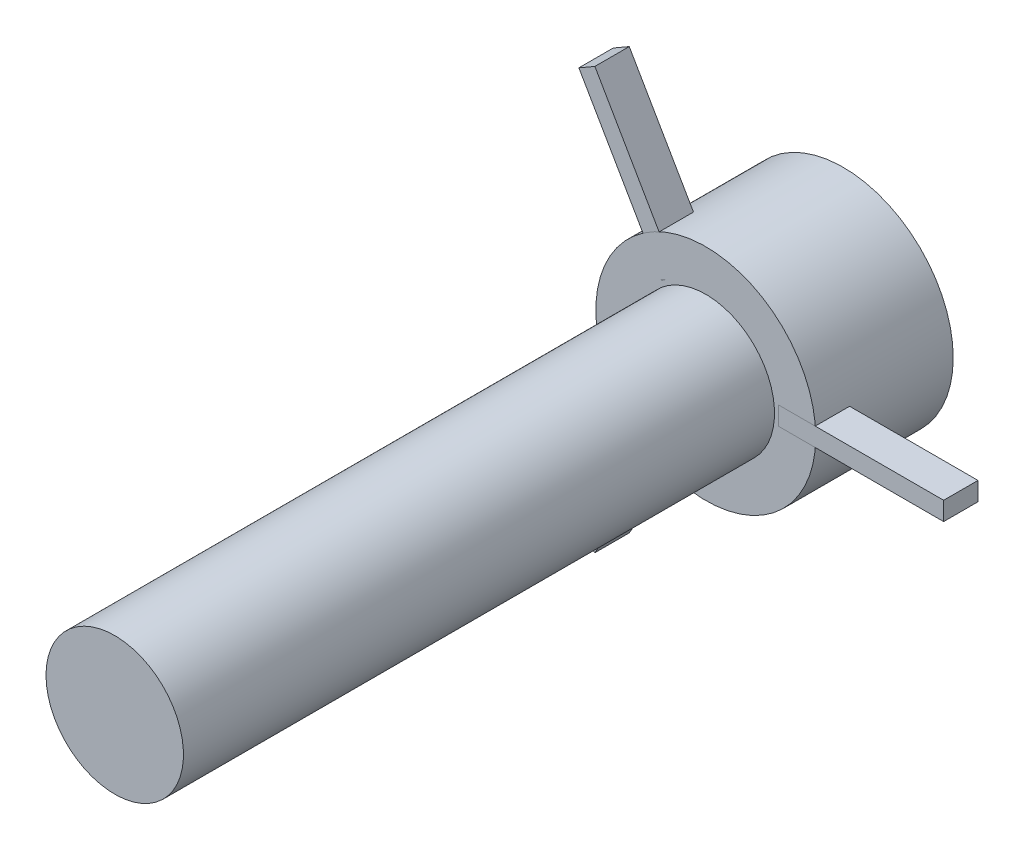
ISO-10303-21;
HEADER;
FILE_DESCRIPTION(('STEP AP214'),'2;1');
FILE_NAME('part.step','',(''),(''),'','','');
FILE_SCHEMA(('AUTOMOTIVE_DESIGN { 1 0 10303 214 1 1 1 1 }'));
ENDSEC;
DATA;
#1=APPLICATION_CONTEXT('core data for automotive mechanical design processes');
#2=APPLICATION_PROTOCOL_DEFINITION('international standard','automotive_design',2000,#1);
#3=PRODUCT_CONTEXT('',#1,'mechanical');
#4=PRODUCT('Part','Part','',(#3));
#5=PRODUCT_RELATED_PRODUCT_CATEGORY('part','',(#4));
#6=PRODUCT_DEFINITION_FORMATION('','',#4);
#7=PRODUCT_DEFINITION_CONTEXT('part definition',#1,'design');
#8=PRODUCT_DEFINITION('design','',#6,#7);
#9=PRODUCT_DEFINITION_SHAPE('','',#8);
#10=(LENGTH_UNIT() NAMED_UNIT(*) SI_UNIT(.MILLI.,.METRE.));
#11=(NAMED_UNIT(*) PLANE_ANGLE_UNIT() SI_UNIT($,.RADIAN.));
#12=(NAMED_UNIT(*) SI_UNIT($,.STERADIAN.) SOLID_ANGLE_UNIT());
#13=UNCERTAINTY_MEASURE_WITH_UNIT(LENGTH_MEASURE(1.E-05),#10,'distance_accuracy_value','');
#14=(GEOMETRIC_REPRESENTATION_CONTEXT(3) GLOBAL_UNCERTAINTY_ASSIGNED_CONTEXT((#13)) GLOBAL_UNIT_ASSIGNED_CONTEXT((#10,
#11,#12)) REPRESENTATION_CONTEXT('',''));
#15=CARTESIAN_POINT('',(0.,0.,0.));
#16=DIRECTION('',(0.,0.,1.));
#17=DIRECTION('',(1.,0.,0.));
#18=AXIS2_PLACEMENT_3D('',#15,#16,#17);
#19=CARTESIAN_POINT('',(0.530299214484411,-0.0672792870348632,-0.25));
#20=DIRECTION('',(0.,-1.,0.));
#21=DIRECTION('',(0.,0.,-1.));
#22=AXIS2_PLACEMENT_3D('',#19,#20,#21);
#23=PLANE('',#22);
#24=DIRECTION('',(1.,0.,0.));
#25=VECTOR('',#24,1.);
#26=CARTESIAN_POINT('',(0.,-0.0672792870348632,-0.25));
#27=LINE('',#26,#25);
#28=CARTESIAN_POINT('',(0.530299214484411,-0.0672792870348632,-0.25));
#29=VERTEX_POINT('',#28);
#30=CARTESIAN_POINT('',(1.73029921448441,-0.0672792870348632,-0.25));
#31=VERTEX_POINT('',#30);
#32=EDGE_CURVE('P0_E55',#29,#31,#27,.T.);
#33=ORIENTED_EDGE('',*,*,#32,.T.);
#34=DIRECTION('',(0.,0.,1.));
#35=VECTOR('',#34,1.);
#36=CARTESIAN_POINT('',(1.73029921448441,-0.0672792870348632,-0.25));
#37=LINE('',#36,#35);
#38=CARTESIAN_POINT('',(1.73029921448441,-0.0672792870348632,0.));
#39=VERTEX_POINT('',#38);
#40=EDGE_CURVE('P0_E67',#39,#31,#37,.F.);
#41=ORIENTED_EDGE('',*,*,#40,.F.);
#42=DIRECTION('',(1.,0.,0.));
#43=VECTOR('',#42,1.);
#44=CARTESIAN_POINT('',(0.,-0.0672792870348632,0.));
#45=LINE('',#44,#43);
#46=CARTESIAN_POINT('',(0.530299214484411,-0.0672792870348632,0.));
#47=VERTEX_POINT('',#46);
#48=EDGE_CURVE('P0_E20',#47,#39,#45,.T.);
#49=ORIENTED_EDGE('',*,*,#48,.F.);
#50=DIRECTION('',(0.,0.,1.));
#51=VECTOR('',#50,1.);
#52=CARTESIAN_POINT('',(0.530299214484411,-0.0672792870348632,-0.25));
#53=LINE('',#52,#51);
#54=EDGE_CURVE('P0_E81',#29,#47,#53,.T.);
#55=ORIENTED_EDGE('',*,*,#54,.F.);
#56=EDGE_LOOP('',(#33,#41,#49,#55));
#57=FACE_BOUND('',#56,.T.);
#58=ADVANCED_FACE('P0_F17',(#57),#23,.T.);
#59=CARTESIAN_POINT('',(0.,0.,0.));
#60=DIRECTION('',(0.,0.,1.));
#61=DIRECTION('',(1.,0.,0.));
#62=AXIS2_PLACEMENT_3D('',#59,#60,#61);
#63=PLANE('',#62);
#64=DIRECTION('',(0.,1.,0.));
#65=VECTOR('',#64,1.);
#66=CARTESIAN_POINT('',(1.73029921448441,-0.0672792870348632,0.));
#67=LINE('',#66,#65);
#68=CARTESIAN_POINT('',(1.73029921448441,0.0672792870348632,0.));
#69=VERTEX_POINT('',#68);
#70=EDGE_CURVE('P0_E62',#69,#39,#67,.F.);
#71=ORIENTED_EDGE('',*,*,#70,.F.);
#72=DIRECTION('',(1.,0.,0.));
#73=VECTOR('',#72,1.);
#74=CARTESIAN_POINT('',(1.73029921448441,0.0672792870348632,0.));
#75=LINE('',#74,#73);
#76=CARTESIAN_POINT('',(0.530299214484411,0.0672792870348632,0.));
#77=VERTEX_POINT('',#76);
#78=EDGE_CURVE('P0_E83',#77,#69,#75,.T.);
#79=ORIENTED_EDGE('',*,*,#78,.F.);
#80=DIRECTION('',(0.,-1.,0.));
#81=VECTOR('',#80,1.);
#82=CARTESIAN_POINT('',(0.530299214484411,0.0672792870348632,0.));
#83=LINE('',#82,#81);
#84=EDGE_CURVE('P0_E65',#47,#77,#83,.F.);
#85=ORIENTED_EDGE('',*,*,#84,.F.);
#86=ORIENTED_EDGE('',*,*,#48,.T.);
#87=EDGE_LOOP('',(#71,#79,#85,#86));
#88=FACE_BOUND('',#87,.T.);
#89=ADVANCED_FACE('P0_F60',(#88),#63,.T.);
#90=CARTESIAN_POINT('',(1.73029921448441,-0.0672792870348632,-0.25));
#91=DIRECTION('',(1.,0.,0.));
#92=DIRECTION('',(0.,1.,0.));
#93=AXIS2_PLACEMENT_3D('',#90,#91,#92);
#94=PLANE('',#93);
#95=DIRECTION('',(0.,1.,0.));
#96=VECTOR('',#95,1.);
#97=CARTESIAN_POINT('',(1.73029921448441,0.,-0.25));
#98=LINE('',#97,#96);
#99=CARTESIAN_POINT('',(1.73029921448441,0.0672792870348632,-0.25));
#100=VERTEX_POINT('',#99);
#101=EDGE_CURVE('P0_E77',#31,#100,#98,.T.);
#102=ORIENTED_EDGE('',*,*,#101,.T.);
#103=DIRECTION('',(0.,0.,1.));
#104=VECTOR('',#103,1.);
#105=CARTESIAN_POINT('',(1.73029921448441,0.0672792870348632,-0.25));
#106=LINE('',#105,#104);
#107=EDGE_CURVE('P0_E73',#69,#100,#106,.F.);
#108=ORIENTED_EDGE('',*,*,#107,.F.);
#109=ORIENTED_EDGE('',*,*,#70,.T.);
#110=ORIENTED_EDGE('',*,*,#40,.T.);
#111=EDGE_LOOP('',(#102,#108,#109,#110));
#112=FACE_BOUND('',#111,.T.);
#113=ADVANCED_FACE('P0_F71',(#112),#94,.T.);
#114=CARTESIAN_POINT('',(0.,0.,-0.25));
#115=DIRECTION('',(0.,0.,1.));
#116=DIRECTION('',(1.,0.,0.));
#117=AXIS2_PLACEMENT_3D('',#114,#115,#116);
#118=PLANE('',#117);
#119=DIRECTION('',(1.,0.,0.));
#120=VECTOR('',#119,1.);
#121=CARTESIAN_POINT('',(1.73029921448441,0.0672792870348632,-0.25));
#122=LINE('',#121,#120);
#123=CARTESIAN_POINT('',(0.530299214484411,0.0672792870348632,-0.25));
#124=VERTEX_POINT('',#123);
#125=EDGE_CURVE('P0_E26',#100,#124,#122,.F.);
#126=ORIENTED_EDGE('',*,*,#125,.F.);
#127=ORIENTED_EDGE('',*,*,#101,.F.);
#128=ORIENTED_EDGE('',*,*,#32,.F.);
#129=DIRECTION('',(0.,-1.,0.));
#130=VECTOR('',#129,1.);
#131=CARTESIAN_POINT('',(0.530299214484411,0.0672792870348632,-0.25));
#132=LINE('',#131,#130);
#133=EDGE_CURVE('P0_E35',#124,#29,#132,.T.);
#134=ORIENTED_EDGE('',*,*,#133,.F.);
#135=EDGE_LOOP('',(#126,#127,#128,#134));
#136=FACE_BOUND('',#135,.T.);
#137=ADVANCED_FACE('P0_F89',(#136),#118,.F.);
#138=CARTESIAN_POINT('',(0.530299214484411,0.0672792870348632,-0.25));
#139=DIRECTION('',(-1.,0.,0.));
#140=DIRECTION('',(0.,-1.,0.));
#141=AXIS2_PLACEMENT_3D('',#138,#139,#140);
#142=PLANE('',#141);
#143=ORIENTED_EDGE('',*,*,#133,.T.);
#144=ORIENTED_EDGE('',*,*,#54,.T.);
#145=ORIENTED_EDGE('',*,*,#84,.T.);
#146=DIRECTION('',(0.,0.,1.));
#147=VECTOR('',#146,1.);
#148=CARTESIAN_POINT('',(0.530299214484411,0.0672792870348632,-0.25));
#149=LINE('',#148,#147);
#150=EDGE_CURVE('P0_E11',#124,#77,#149,.T.);
#151=ORIENTED_EDGE('',*,*,#150,.F.);
#152=EDGE_LOOP('',(#143,#144,#145,#151));
#153=FACE_BOUND('',#152,.T.);
#154=ADVANCED_FACE('P0_F91',(#153),#142,.T.);
#155=CARTESIAN_POINT('',(1.73029921448441,0.0672792870348632,-0.25));
#156=DIRECTION('',(0.,1.,0.));
#157=DIRECTION('',(0.,0.,1.));
#158=AXIS2_PLACEMENT_3D('',#155,#156,#157);
#159=PLANE('',#158);
#160=ORIENTED_EDGE('',*,*,#125,.T.);
#161=ORIENTED_EDGE('',*,*,#150,.T.);
#162=ORIENTED_EDGE('',*,*,#78,.T.);
#163=ORIENTED_EDGE('',*,*,#107,.T.);
#164=EDGE_LOOP('',(#160,#161,#162,#163));
#165=FACE_BOUND('',#164,.T.);
#166=ADVANCED_FACE('P0_F88',(#165),#159,.T.);
#167=CLOSED_SHELL('',(#58,#89,#113,#137,#154,#166));
#168=MANIFOLD_SOLID_BREP('P0_B1',#167);
#169=CARTESIAN_POINT('',(0.,0.,-1.));
#170=DIRECTION('',(0.,0.,1.));
#171=DIRECTION('',(1.,0.,0.));
#172=AXIS2_PLACEMENT_3D('',#169,#170,#171);
#173=PLANE('',#172);
#174=CARTESIAN_POINT('',(0.,0.,-1.));
#175=DIRECTION('',(0.,0.,1.));
#176=DIRECTION('',(1.,0.,0.));
#177=AXIS2_PLACEMENT_3D('',#174,#175,#176);
#178=CIRCLE('',#177,0.8);
#179=CARTESIAN_POINT('',(0.8,0.,-1.));
#180=VERTEX_POINT('',#179);
#181=EDGE_CURVE('P1_E18',#180,#180,#178,.T.);
#182=ORIENTED_EDGE('',*,*,#181,.F.);
#183=EDGE_LOOP('',(#182));
#184=FACE_BOUND('',#183,.T.);
#185=ADVANCED_FACE('P1_F15',(#184),#173,.F.);
#186=CARTESIAN_POINT('',(0.,0.,-1.));
#187=DIRECTION('',(0.,0.,1.));
#188=DIRECTION('',(1.,0.,0.));
#189=AXIS2_PLACEMENT_3D('',#186,#187,#188);
#190=CYLINDRICAL_SURFACE('',#189,0.8);
#191=CARTESIAN_POINT('',(0.,0.,0.));
#192=DIRECTION('',(0.,0.,1.));
#193=DIRECTION('',(1.,0.,0.));
#194=AXIS2_PLACEMENT_3D('',#191,#192,#193);
#195=CIRCLE('',#194,0.8);
#196=CARTESIAN_POINT('',(0.8,0.,0.));
#197=VERTEX_POINT('',#196);
#198=EDGE_CURVE('P1_E27',#197,#197,#195,.T.);
#199=ORIENTED_EDGE('',*,*,#198,.F.);
#200=EDGE_LOOP('',(#199));
#201=FACE_BOUND('',#200,.T.);
#202=ORIENTED_EDGE('',*,*,#181,.T.);
#203=EDGE_LOOP('',(#202));
#204=FACE_BOUND('',#203,.T.);
#205=ADVANCED_FACE('P1_F35',(#201,#204),#190,.T.);
#206=CARTESIAN_POINT('',(0.,0.,4.3));
#207=DIRECTION('',(0.,0.,1.));
#208=DIRECTION('',(1.,0.,0.));
#209=AXIS2_PLACEMENT_3D('',#206,#207,#208);
#210=PLANE('',#209);
#211=CARTESIAN_POINT('',(0.,0.,4.3));
#212=DIRECTION('',(0.,0.,-1.));
#213=DIRECTION('',(-1.,0.,0.));
#214=AXIS2_PLACEMENT_3D('',#211,#212,#213);
#215=CIRCLE('',#214,0.5);
#216=CARTESIAN_POINT('',(-0.5,0.,4.3));
#217=VERTEX_POINT('',#216);
#218=EDGE_CURVE('P1_E22',#217,#217,#215,.T.);
#219=ORIENTED_EDGE('',*,*,#218,.F.);
#220=EDGE_LOOP('',(#219));
#221=FACE_BOUND('',#220,.T.);
#222=ADVANCED_FACE('P1_F42',(#221),#210,.T.);
#223=CARTESIAN_POINT('',(0.,0.,0.));
#224=DIRECTION('',(0.,0.,1.));
#225=DIRECTION('',(1.,0.,0.));
#226=AXIS2_PLACEMENT_3D('',#223,#224,#225);
#227=PLANE('',#226);
#228=CARTESIAN_POINT('',(0.,0.,0.));
#229=DIRECTION('',(0.,0.,-1.));
#230=DIRECTION('',(-1.,0.,0.));
#231=AXIS2_PLACEMENT_3D('',#228,#229,#230);
#232=CIRCLE('',#231,0.5);
#233=CARTESIAN_POINT('',(-0.5,0.,0.));
#234=VERTEX_POINT('',#233);
#235=EDGE_CURVE('P1_E10',#234,#234,#232,.F.);
#236=ORIENTED_EDGE('',*,*,#235,.F.);
#237=EDGE_LOOP('',(#236));
#238=FACE_BOUND('',#237,.T.);
#239=ORIENTED_EDGE('',*,*,#198,.T.);
#240=EDGE_LOOP('',(#239));
#241=FACE_BOUND('',#240,.T.);
#242=ADVANCED_FACE('P1_F46',(#238,#241),#227,.T.);
#243=CARTESIAN_POINT('',(0.,0.,4.3));
#244=DIRECTION('',(0.,0.,-1.));
#245=DIRECTION('',(-1.,0.,0.));
#246=AXIS2_PLACEMENT_3D('',#243,#244,#245);
#247=CYLINDRICAL_SURFACE('',#246,0.5);
#248=ORIENTED_EDGE('',*,*,#235,.T.);
#249=EDGE_LOOP('',(#248));
#250=FACE_BOUND('',#249,.T.);
#251=ORIENTED_EDGE('',*,*,#218,.T.);
#252=EDGE_LOOP('',(#251));
#253=FACE_BOUND('',#252,.T.);
#254=ADVANCED_FACE('P1_F44',(#250,#253),#247,.T.);
#255=CLOSED_SHELL('',(#185,#205,#222,#242,#254));
#256=MANIFOLD_SOLID_BREP('P1_B1',#255);
#257=CARTESIAN_POINT('',(-0.206884035521509,0.492892234867865,-0.25));
#258=DIRECTION('',(0.866025403784439,0.499999999999999,0.));
#259=DIRECTION('',(-0.499999999999999,0.866025403784439,0.));
#260=AXIS2_PLACEMENT_3D('',#257,#258,#259);
#261=PLANE('',#260);
#262=DIRECTION('',(-0.499999999999999,0.866025403784439,0.));
#263=VECTOR('',#262,1.);
#264=CARTESIAN_POINT('',(-0.206884035521509,0.492892234867865,-0.25));
#265=LINE('',#264,#263);
#266=CARTESIAN_POINT('',(-0.206884035521509,0.492892234867865,-0.25));
#267=VERTEX_POINT('',#266);
#268=CARTESIAN_POINT('',(-0.806884035521507,1.53212271940919,-0.25));
#269=VERTEX_POINT('',#268);
#270=EDGE_CURVE('P2_E55',#267,#269,#265,.T.);
#271=ORIENTED_EDGE('',*,*,#270,.T.);
#272=DIRECTION('',(0.,0.,1.));
#273=VECTOR('',#272,1.);
#274=CARTESIAN_POINT('',(-0.806884035521507,1.53212271940919,-0.25));
#275=LINE('',#274,#273);
#276=CARTESIAN_POINT('',(-0.806884035521507,1.53212271940919,0.));
#277=VERTEX_POINT('',#276);
#278=EDGE_CURVE('P2_E67',#277,#269,#275,.F.);
#279=ORIENTED_EDGE('',*,*,#278,.F.);
#280=DIRECTION('',(-0.499999999999999,0.866025403784439,0.));
#281=VECTOR('',#280,1.);
#282=CARTESIAN_POINT('',(-0.206884035521509,0.492892234867865,0.));
#283=LINE('',#282,#281);
#284=CARTESIAN_POINT('',(-0.206884035521509,0.492892234867865,0.));
#285=VERTEX_POINT('',#284);
#286=EDGE_CURVE('P2_E20',#285,#277,#283,.T.);
#287=ORIENTED_EDGE('',*,*,#286,.F.);
#288=DIRECTION('',(0.,0.,1.));
#289=VECTOR('',#288,1.);
#290=CARTESIAN_POINT('',(-0.206884035521509,0.492892234867865,-0.25));
#291=LINE('',#290,#289);
#292=EDGE_CURVE('P2_E81',#267,#285,#291,.T.);
#293=ORIENTED_EDGE('',*,*,#292,.F.);
#294=EDGE_LOOP('',(#271,#279,#287,#293));
#295=FACE_BOUND('',#294,.T.);
#296=ADVANCED_FACE('P2_F17',(#295),#261,.T.);
#297=CARTESIAN_POINT('',(0.,0.,0.));
#298=DIRECTION('',(0.,0.,1.));
#299=DIRECTION('',(1.,0.,0.));
#300=AXIS2_PLACEMENT_3D('',#297,#298,#299);
#301=PLANE('',#300);
#302=ORIENTED_EDGE('',*,*,#286,.T.);
#303=DIRECTION('',(-0.866025403784438,-0.5,0.));
#304=VECTOR('',#303,1.);
#305=CARTESIAN_POINT('',(-0.806884035521507,1.53212271940919,0.));
#306=LINE('',#305,#304);
#307=CARTESIAN_POINT('',(-0.9234151789629,1.46484343237433,0.));
#308=VERTEX_POINT('',#307);
#309=EDGE_CURVE('P2_E62',#308,#277,#306,.F.);
#310=ORIENTED_EDGE('',*,*,#309,.F.);
#311=DIRECTION('',(0.499999999999999,-0.866025403784439,0.));
#312=VECTOR('',#311,1.);
#313=CARTESIAN_POINT('',(-0.9234151789629,1.46484343237433,0.));
#314=LINE('',#313,#312);
#315=CARTESIAN_POINT('',(-0.323415178962902,0.425612947833002,0.));
#316=VERTEX_POINT('',#315);
#317=EDGE_CURVE('P2_E83',#316,#308,#314,.F.);
#318=ORIENTED_EDGE('',*,*,#317,.F.);
#319=DIRECTION('',(0.866025403784439,0.499999999999999,0.));
#320=VECTOR('',#319,1.);
#321=CARTESIAN_POINT('',(-0.323415178962902,0.425612947833002,0.));
#322=LINE('',#321,#320);
#323=EDGE_CURVE('P2_E65',#285,#316,#322,.F.);
#324=ORIENTED_EDGE('',*,*,#323,.F.);
#325=EDGE_LOOP('',(#302,#310,#318,#324));
#326=FACE_BOUND('',#325,.T.);
#327=ADVANCED_FACE('P2_F60',(#326),#301,.T.);
#328=CARTESIAN_POINT('',(-0.806884035521507,1.53212271940919,-0.25));
#329=DIRECTION('',(-0.5,0.866025403784438,0.));
#330=DIRECTION('',(-0.866025403784438,-0.5,0.));
#331=AXIS2_PLACEMENT_3D('',#328,#329,#330);
#332=PLANE('',#331);
#333=DIRECTION('',(-0.866025403784449,-0.499999999999982,0.));
#334=VECTOR('',#333,1.);
#335=CARTESIAN_POINT('',(-0.806884035521507,1.53212271940919,-0.25));
#336=LINE('',#335,#334);
#337=CARTESIAN_POINT('',(-0.923415178962899,1.46484343237433,-0.25));
#338=VERTEX_POINT('',#337);
#339=EDGE_CURVE('P2_E77',#269,#338,#336,.T.);
#340=ORIENTED_EDGE('',*,*,#339,.T.);
#341=DIRECTION('',(0.,0.,1.));
#342=VECTOR('',#341,1.);
#343=CARTESIAN_POINT('',(-0.9234151789629,1.46484343237433,-0.25));
#344=LINE('',#343,#342);
#345=EDGE_CURVE('P2_E73',#308,#338,#344,.F.);
#346=ORIENTED_EDGE('',*,*,#345,.F.);
#347=ORIENTED_EDGE('',*,*,#309,.T.);
#348=ORIENTED_EDGE('',*,*,#278,.T.);
#349=EDGE_LOOP('',(#340,#346,#347,#348));
#350=FACE_BOUND('',#349,.T.);
#351=ADVANCED_FACE('P2_F71',(#350),#332,.T.);
#352=CARTESIAN_POINT('',(0.,0.,-0.25));
#353=DIRECTION('',(0.,0.,1.));
#354=DIRECTION('',(1.,0.,0.));
#355=AXIS2_PLACEMENT_3D('',#352,#353,#354);
#356=PLANE('',#355);
#357=ORIENTED_EDGE('',*,*,#339,.F.);
#358=ORIENTED_EDGE('',*,*,#270,.F.);
#359=DIRECTION('',(0.866025403784439,0.499999999999999,0.));
#360=VECTOR('',#359,1.);
#361=CARTESIAN_POINT('',(-0.323415178962902,0.425612947833002,-0.25));
#362=LINE('',#361,#360);
#363=CARTESIAN_POINT('',(-0.323415178962902,0.425612947833002,-0.25));
#364=VERTEX_POINT('',#363);
#365=EDGE_CURVE('P2_E35',#364,#267,#362,.T.);
#366=ORIENTED_EDGE('',*,*,#365,.F.);
#367=DIRECTION('',(0.499999999999999,-0.866025403784439,0.));
#368=VECTOR('',#367,1.);
#369=CARTESIAN_POINT('',(-0.9234151789629,1.46484343237433,-0.25));
#370=LINE('',#369,#368);
#371=EDGE_CURVE('P2_E26',#338,#364,#370,.T.);
#372=ORIENTED_EDGE('',*,*,#371,.F.);
#373=EDGE_LOOP('',(#357,#358,#366,#372));
#374=FACE_BOUND('',#373,.T.);
#375=ADVANCED_FACE('P2_F89',(#374),#356,.F.);
#376=CARTESIAN_POINT('',(-0.323415178962902,0.425612947833002,-0.25));
#377=DIRECTION('',(0.499999999999999,-0.866025403784439,0.));
#378=DIRECTION('',(0.866025403784439,0.499999999999999,0.));
#379=AXIS2_PLACEMENT_3D('',#376,#377,#378);
#380=PLANE('',#379);
#381=ORIENTED_EDGE('',*,*,#365,.T.);
#382=ORIENTED_EDGE('',*,*,#292,.T.);
#383=ORIENTED_EDGE('',*,*,#323,.T.);
#384=DIRECTION('',(0.,0.,1.));
#385=VECTOR('',#384,1.);
#386=CARTESIAN_POINT('',(-0.323415178962901,0.425612947833003,-0.25));
#387=LINE('',#386,#385);
#388=EDGE_CURVE('P2_E11',#364,#316,#387,.T.);
#389=ORIENTED_EDGE('',*,*,#388,.F.);
#390=EDGE_LOOP('',(#381,#382,#383,#389));
#391=FACE_BOUND('',#390,.T.);
#392=ADVANCED_FACE('P2_F91',(#391),#380,.T.);
#393=CARTESIAN_POINT('',(-0.9234151789629,1.46484343237433,-0.25));
#394=DIRECTION('',(-0.866025403784439,-0.499999999999999,0.));
#395=DIRECTION('',(0.499999999999999,-0.866025403784439,0.));
#396=AXIS2_PLACEMENT_3D('',#393,#394,#395);
#397=PLANE('',#396);
#398=ORIENTED_EDGE('',*,*,#371,.T.);
#399=ORIENTED_EDGE('',*,*,#388,.T.);
#400=ORIENTED_EDGE('',*,*,#317,.T.);
#401=ORIENTED_EDGE('',*,*,#345,.T.);
#402=EDGE_LOOP('',(#398,#399,#400,#401));
#403=FACE_BOUND('',#402,.T.);
#404=ADVANCED_FACE('P2_F88',(#403),#397,.T.);
#405=CLOSED_SHELL('',(#296,#327,#351,#375,#392,#404));
#406=MANIFOLD_SOLID_BREP('P2_B1',#405);
#407=CARTESIAN_POINT('',(-0.806884035521514,-1.53212271940919,-0.25));
#408=DIRECTION('',(0.866025403784437,-0.500000000000003,0.));
#409=DIRECTION('',(0.500000000000003,0.866025403784437,0.));
#410=AXIS2_PLACEMENT_3D('',#407,#408,#409);
#411=PLANE('',#410);
#412=DIRECTION('',(0.500000000000002,0.866025403784437,0.));
#413=VECTOR('',#412,1.);
#414=CARTESIAN_POINT('',(-0.806884035521514,-1.53212271940919,-0.25));
#415=LINE('',#414,#413);
#416=CARTESIAN_POINT('',(-0.806884035521514,-1.53212271940919,-0.25));
#417=VERTEX_POINT('',#416);
#418=CARTESIAN_POINT('',(-0.20688403552151,-0.492892234867864,-0.25));
#419=VERTEX_POINT('',#418);
#420=EDGE_CURVE('P3_E55',#417,#419,#415,.T.);
#421=ORIENTED_EDGE('',*,*,#420,.T.);
#422=DIRECTION('',(0.,0.,1.));
#423=VECTOR('',#422,1.);
#424=CARTESIAN_POINT('',(-0.206884035521511,-0.492892234867864,-0.25));
#425=LINE('',#424,#423);
#426=CARTESIAN_POINT('',(-0.206884035521511,-0.492892234867864,0.));
#427=VERTEX_POINT('',#426);
#428=EDGE_CURVE('P3_E67',#427,#419,#425,.F.);
#429=ORIENTED_EDGE('',*,*,#428,.F.);
#430=DIRECTION('',(0.500000000000002,0.866025403784437,0.));
#431=VECTOR('',#430,1.);
#432=CARTESIAN_POINT('',(-0.806884035521514,-1.53212271940919,0.));
#433=LINE('',#432,#431);
#434=CARTESIAN_POINT('',(-0.806884035521514,-1.53212271940919,0.));
#435=VERTEX_POINT('',#434);
#436=EDGE_CURVE('P3_E20',#435,#427,#433,.T.);
#437=ORIENTED_EDGE('',*,*,#436,.F.);
#438=DIRECTION('',(0.,0.,1.));
#439=VECTOR('',#438,1.);
#440=CARTESIAN_POINT('',(-0.806884035521516,-1.53212271940919,-0.25));
#441=LINE('',#440,#439);
#442=EDGE_CURVE('P3_E81',#417,#435,#441,.T.);
#443=ORIENTED_EDGE('',*,*,#442,.F.);
#444=EDGE_LOOP('',(#421,#429,#437,#443));
#445=FACE_BOUND('',#444,.T.);
#446=ADVANCED_FACE('P3_F17',(#445),#411,.T.);
#447=CARTESIAN_POINT('',(0.,0.,0.));
#448=DIRECTION('',(0.,0.,1.));
#449=DIRECTION('',(1.,0.,0.));
#450=AXIS2_PLACEMENT_3D('',#447,#448,#449);
#451=PLANE('',#450);
#452=DIRECTION('',(-0.866025403784437,0.500000000000002,0.));
#453=VECTOR('',#452,1.);
#454=CARTESIAN_POINT('',(-0.206884035521511,-0.492892234867864,0.));
#455=LINE('',#454,#453);
#456=CARTESIAN_POINT('',(-0.323415178962904,-0.425612947833001,0.));
#457=VERTEX_POINT('',#456);
#458=EDGE_CURVE('P3_E62',#457,#427,#455,.F.);
#459=ORIENTED_EDGE('',*,*,#458,.F.);
#460=DIRECTION('',(-0.500000000000003,-0.866025403784437,0.));
#461=VECTOR('',#460,1.);
#462=CARTESIAN_POINT('',(-0.323415178962904,-0.425612947833001,0.));
#463=LINE('',#462,#461);
#464=CARTESIAN_POINT('',(-0.923415178962908,-1.46484343237433,0.));
#465=VERTEX_POINT('',#464);
#466=EDGE_CURVE('P3_E83',#465,#457,#463,.F.);
#467=ORIENTED_EDGE('',*,*,#466,.F.);
#468=DIRECTION('',(0.866025403784437,-0.500000000000002,0.));
#469=VECTOR('',#468,1.);
#470=CARTESIAN_POINT('',(-0.923415178962907,-1.46484343237433,0.));
#471=LINE('',#470,#469);
#472=EDGE_CURVE('P3_E65',#435,#465,#471,.F.);
#473=ORIENTED_EDGE('',*,*,#472,.F.);
#474=ORIENTED_EDGE('',*,*,#436,.T.);
#475=EDGE_LOOP('',(#459,#467,#473,#474));
#476=FACE_BOUND('',#475,.T.);
#477=ADVANCED_FACE('P3_F60',(#476),#451,.T.);
#478=CARTESIAN_POINT('',(-0.206884035521511,-0.492892234867864,-0.25));
#479=DIRECTION('',(0.500000000000002,0.866025403784437,0.));
#480=DIRECTION('',(-0.866025403784437,0.500000000000002,0.));
#481=AXIS2_PLACEMENT_3D('',#478,#479,#480);
#482=PLANE('',#481);
#483=DIRECTION('',(-0.866025403784439,0.499999999999999,0.));
#484=VECTOR('',#483,1.);
#485=CARTESIAN_POINT('',(-0.206884035521511,-0.492892234867864,-0.25));
#486=LINE('',#485,#484);
#487=CARTESIAN_POINT('',(-0.323415178962904,-0.425612947833001,-0.25));
#488=VERTEX_POINT('',#487);
#489=EDGE_CURVE('P3_E77',#419,#488,#486,.T.);
#490=ORIENTED_EDGE('',*,*,#489,.T.);
#491=DIRECTION('',(0.,0.,1.));
#492=VECTOR('',#491,1.);
#493=CARTESIAN_POINT('',(-0.323415178962904,-0.425612947833001,-0.25));
#494=LINE('',#493,#492);
#495=EDGE_CURVE('P3_E73',#457,#488,#494,.F.);
#496=ORIENTED_EDGE('',*,*,#495,.F.);
#497=ORIENTED_EDGE('',*,*,#458,.T.);
#498=ORIENTED_EDGE('',*,*,#428,.T.);
#499=EDGE_LOOP('',(#490,#496,#497,#498));
#500=FACE_BOUND('',#499,.T.);
#501=ADVANCED_FACE('P3_F71',(#500),#482,.T.);
#502=CARTESIAN_POINT('',(0.,0.,-0.25));
#503=DIRECTION('',(0.,0.,1.));
#504=DIRECTION('',(1.,0.,0.));
#505=AXIS2_PLACEMENT_3D('',#502,#503,#504);
#506=PLANE('',#505);
#507=DIRECTION('',(-0.500000000000003,-0.866025403784437,0.));
#508=VECTOR('',#507,1.);
#509=CARTESIAN_POINT('',(-0.323415178962904,-0.425612947833001,-0.25));
#510=LINE('',#509,#508);
#511=CARTESIAN_POINT('',(-0.923415178962908,-1.46484343237433,-0.25));
#512=VERTEX_POINT('',#511);
#513=EDGE_CURVE('P3_E26',#488,#512,#510,.T.);
#514=ORIENTED_EDGE('',*,*,#513,.F.);
#515=ORIENTED_EDGE('',*,*,#489,.F.);
#516=ORIENTED_EDGE('',*,*,#420,.F.);
#517=DIRECTION('',(0.866025403784437,-0.500000000000002,0.));
#518=VECTOR('',#517,1.);
#519=CARTESIAN_POINT('',(-0.923415178962907,-1.46484343237433,-0.25));
#520=LINE('',#519,#518);
#521=EDGE_CURVE('P3_E35',#512,#417,#520,.T.);
#522=ORIENTED_EDGE('',*,*,#521,.F.);
#523=EDGE_LOOP('',(#514,#515,#516,#522));
#524=FACE_BOUND('',#523,.T.);
#525=ADVANCED_FACE('P3_F89',(#524),#506,.F.);
#526=CARTESIAN_POINT('',(-0.923415178962907,-1.46484343237433,-0.25));
#527=DIRECTION('',(-0.500000000000002,-0.866025403784437,0.));
#528=DIRECTION('',(0.866025403784437,-0.500000000000002,0.));
#529=AXIS2_PLACEMENT_3D('',#526,#527,#528);
#530=PLANE('',#529);
#531=ORIENTED_EDGE('',*,*,#521,.T.);
#532=ORIENTED_EDGE('',*,*,#442,.T.);
#533=ORIENTED_EDGE('',*,*,#472,.T.);
#534=DIRECTION('',(0.,0.,1.));
#535=VECTOR('',#534,1.);
#536=CARTESIAN_POINT('',(-0.923415178962909,-1.46484343237433,-0.25));
#537=LINE('',#536,#535);
#538=EDGE_CURVE('P3_E11',#512,#465,#537,.T.);
#539=ORIENTED_EDGE('',*,*,#538,.F.);
#540=EDGE_LOOP('',(#531,#532,#533,#539));
#541=FACE_BOUND('',#540,.T.);
#542=ADVANCED_FACE('P3_F91',(#541),#530,.T.);
#543=CARTESIAN_POINT('',(-0.323415178962904,-0.425612947833001,-0.25));
#544=DIRECTION('',(-0.866025403784437,0.500000000000003,0.));
#545=DIRECTION('',(-0.500000000000003,-0.866025403784437,0.));
#546=AXIS2_PLACEMENT_3D('',#543,#544,#545);
#547=PLANE('',#546);
#548=ORIENTED_EDGE('',*,*,#513,.T.);
#549=ORIENTED_EDGE('',*,*,#538,.T.);
#550=ORIENTED_EDGE('',*,*,#466,.T.);
#551=ORIENTED_EDGE('',*,*,#495,.T.);
#552=EDGE_LOOP('',(#548,#549,#550,#551));
#553=FACE_BOUND('',#552,.T.);
#554=ADVANCED_FACE('P3_F88',(#553),#547,.T.);
#555=CLOSED_SHELL('',(#446,#477,#501,#525,#542,#554));
#556=MANIFOLD_SOLID_BREP('P3_B1',#555);
#557=ADVANCED_BREP_SHAPE_REPRESENTATION('',(#18,#168,#256,#406,#556),#14);
#558=SHAPE_DEFINITION_REPRESENTATION(#9,#557);
ENDSEC;
END-ISO-10303-21;
